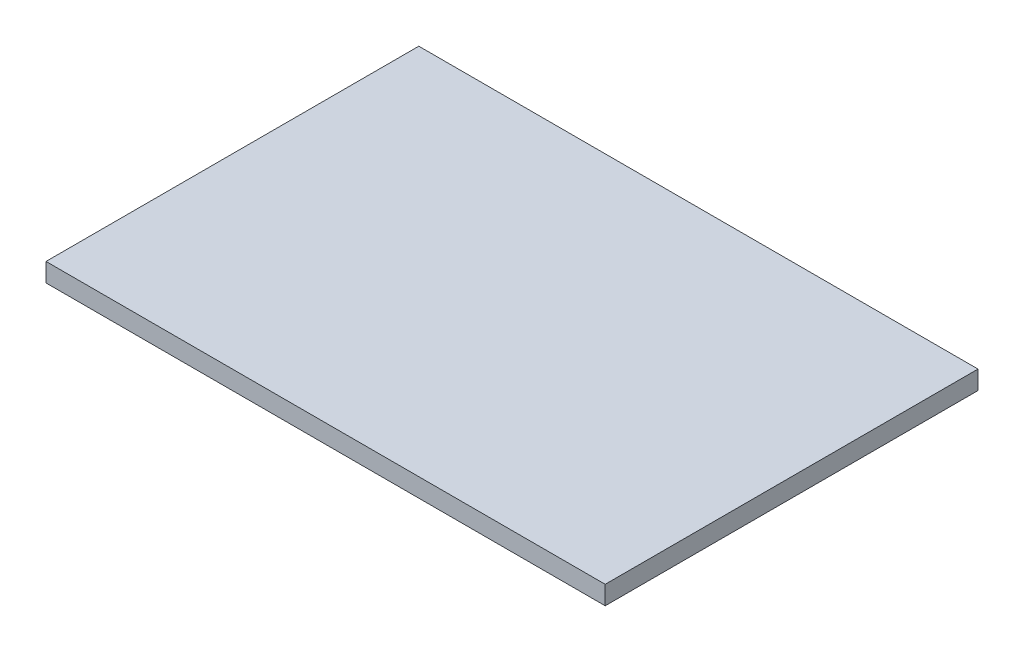
ISO-10303-21;
HEADER;
FILE_DESCRIPTION(('STEP AP214'),'2;1');
FILE_NAME('part.step','',(''),(''),'','','');
FILE_SCHEMA(('AUTOMOTIVE_DESIGN { 1 0 10303 214 1 1 1 1 }'));
ENDSEC;
DATA;
#1=APPLICATION_CONTEXT('core data for automotive mechanical design processes');
#2=APPLICATION_PROTOCOL_DEFINITION('international standard','automotive_design',2000,#1);
#3=PRODUCT_CONTEXT('',#1,'mechanical');
#4=PRODUCT('Part','Part','',(#3));
#5=PRODUCT_RELATED_PRODUCT_CATEGORY('part','',(#4));
#6=PRODUCT_DEFINITION_FORMATION('','',#4);
#7=PRODUCT_DEFINITION_CONTEXT('part definition',#1,'design');
#8=PRODUCT_DEFINITION('design','',#6,#7);
#9=PRODUCT_DEFINITION_SHAPE('','',#8);
#10=(LENGTH_UNIT() NAMED_UNIT(*) SI_UNIT(.MILLI.,.METRE.));
#11=(NAMED_UNIT(*) PLANE_ANGLE_UNIT() SI_UNIT($,.RADIAN.));
#12=(NAMED_UNIT(*) SI_UNIT($,.STERADIAN.) SOLID_ANGLE_UNIT());
#13=UNCERTAINTY_MEASURE_WITH_UNIT(LENGTH_MEASURE(1.E-05),#10,'distance_accuracy_value','');
#14=(GEOMETRIC_REPRESENTATION_CONTEXT(3) GLOBAL_UNCERTAINTY_ASSIGNED_CONTEXT((#13)) GLOBAL_UNIT_ASSIGNED_CONTEXT((#10,
#11,#12)) REPRESENTATION_CONTEXT('',''));
#15=CARTESIAN_POINT('',(0.,0.,0.));
#16=DIRECTION('',(0.,0.,1.));
#17=DIRECTION('',(1.,0.,0.));
#18=AXIS2_PLACEMENT_3D('',#15,#16,#17);
#19=CARTESIAN_POINT('',(150.,10.,100.));
#20=DIRECTION('',(-1.,0.,0.));
#21=DIRECTION('',(0.,0.,1.));
#22=AXIS2_PLACEMENT_3D('',#19,#20,#21);
#23=PLANE('',#22);
#24=DIRECTION('',(0.,0.,-1.));
#25=VECTOR('',#24,1.);
#26=CARTESIAN_POINT('',(150.,0.,100.));
#27=LINE('',#26,#25);
#28=CARTESIAN_POINT('',(150.,0.,100.));
#29=VERTEX_POINT('',#28);
#30=CARTESIAN_POINT('',(150.,0.,-100.));
#31=VERTEX_POINT('',#30);
#32=EDGE_CURVE('E96',#29,#31,#27,.T.);
#33=ORIENTED_EDGE('',*,*,#32,.T.);
#34=DIRECTION('',(0.,-1.,0.));
#35=VECTOR('',#34,1.);
#36=CARTESIAN_POINT('',(150.,10.,-100.));
#37=LINE('',#36,#35);
#38=CARTESIAN_POINT('',(150.,10.,-100.));
#39=VERTEX_POINT('',#38);
#40=EDGE_CURVE('E11',#39,#31,#37,.T.);
#41=ORIENTED_EDGE('',*,*,#40,.F.);
#42=DIRECTION('',(0.,0.,-1.));
#43=VECTOR('',#42,1.);
#44=CARTESIAN_POINT('',(150.,10.,100.));
#45=LINE('',#44,#43);
#46=CARTESIAN_POINT('',(150.,10.,100.));
#47=VERTEX_POINT('',#46);
#48=EDGE_CURVE('E84',#47,#39,#45,.T.);
#49=ORIENTED_EDGE('',*,*,#48,.F.);
#50=DIRECTION('',(0.,-1.,0.));
#51=VECTOR('',#50,1.);
#52=CARTESIAN_POINT('',(150.,10.,100.));
#53=LINE('',#52,#51);
#54=EDGE_CURVE('E92',#47,#29,#53,.T.);
#55=ORIENTED_EDGE('',*,*,#54,.T.);
#56=EDGE_LOOP('',(#33,#41,#49,#55));
#57=FACE_BOUND('',#56,.T.);
#58=ADVANCED_FACE('F33',(#57),#23,.F.);
#59=CARTESIAN_POINT('',(-150.,10.,-100.));
#60=DIRECTION('',(0.,0.,1.));
#61=DIRECTION('',(1.,0.,0.));
#62=AXIS2_PLACEMENT_3D('',#59,#60,#61);
#63=PLANE('',#62);
#64=DIRECTION('',(-1.,0.,0.));
#65=VECTOR('',#64,1.);
#66=CARTESIAN_POINT('',(-150.,0.,-100.));
#67=LINE('',#66,#65);
#68=CARTESIAN_POINT('',(-150.,0.,-100.));
#69=VERTEX_POINT('',#68);
#70=EDGE_CURVE('E88',#31,#69,#67,.T.);
#71=ORIENTED_EDGE('',*,*,#70,.T.);
#72=DIRECTION('',(0.,-1.,0.));
#73=VECTOR('',#72,1.);
#74=CARTESIAN_POINT('',(-150.,10.,-100.));
#75=LINE('',#74,#73);
#76=CARTESIAN_POINT('',(-150.,10.,-100.));
#77=VERTEX_POINT('',#76);
#78=EDGE_CURVE('E41',#77,#69,#75,.T.);
#79=ORIENTED_EDGE('',*,*,#78,.F.);
#80=DIRECTION('',(-1.,0.,0.));
#81=VECTOR('',#80,1.);
#82=CARTESIAN_POINT('',(-150.,10.,-100.));
#83=LINE('',#82,#81);
#84=EDGE_CURVE('E79',#39,#77,#83,.T.);
#85=ORIENTED_EDGE('',*,*,#84,.F.);
#86=ORIENTED_EDGE('',*,*,#40,.T.);
#87=EDGE_LOOP('',(#71,#79,#85,#86));
#88=FACE_BOUND('',#87,.T.);
#89=ADVANCED_FACE('F87',(#88),#63,.F.);
#90=CARTESIAN_POINT('',(-150.,10.,100.));
#91=DIRECTION('',(1.,0.,0.));
#92=DIRECTION('',(0.,0.,-1.));
#93=AXIS2_PLACEMENT_3D('',#90,#91,#92);
#94=PLANE('',#93);
#95=DIRECTION('',(0.,0.,1.));
#96=VECTOR('',#95,1.);
#97=CARTESIAN_POINT('',(-150.,0.,100.));
#98=LINE('',#97,#96);
#99=CARTESIAN_POINT('',(-150.,0.,100.));
#100=VERTEX_POINT('',#99);
#101=EDGE_CURVE('E66',#69,#100,#98,.T.);
#102=ORIENTED_EDGE('',*,*,#101,.T.);
#103=DIRECTION('',(0.,-1.,0.));
#104=VECTOR('',#103,1.);
#105=CARTESIAN_POINT('',(-150.,10.,100.));
#106=LINE('',#105,#104);
#107=CARTESIAN_POINT('',(-150.,10.,100.));
#108=VERTEX_POINT('',#107);
#109=EDGE_CURVE('E89',#108,#100,#106,.T.);
#110=ORIENTED_EDGE('',*,*,#109,.F.);
#111=DIRECTION('',(0.,0.,1.));
#112=VECTOR('',#111,1.);
#113=CARTESIAN_POINT('',(-150.,10.,100.));
#114=LINE('',#113,#112);
#115=EDGE_CURVE('E82',#77,#108,#114,.T.);
#116=ORIENTED_EDGE('',*,*,#115,.F.);
#117=ORIENTED_EDGE('',*,*,#78,.T.);
#118=EDGE_LOOP('',(#102,#110,#116,#117));
#119=FACE_BOUND('',#118,.T.);
#120=ADVANCED_FACE('F90',(#119),#94,.F.);
#121=CARTESIAN_POINT('',(-150.,10.,100.));
#122=DIRECTION('',(0.,0.,-1.));
#123=DIRECTION('',(-1.,0.,0.));
#124=AXIS2_PLACEMENT_3D('',#121,#122,#123);
#125=PLANE('',#124);
#126=DIRECTION('',(1.,0.,0.));
#127=VECTOR('',#126,1.);
#128=CARTESIAN_POINT('',(-150.,0.,100.));
#129=LINE('',#128,#127);
#130=EDGE_CURVE('E72',#100,#29,#129,.T.);
#131=ORIENTED_EDGE('',*,*,#130,.T.);
#132=ORIENTED_EDGE('',*,*,#54,.F.);
#133=DIRECTION('',(1.,0.,0.));
#134=VECTOR('',#133,1.);
#135=CARTESIAN_POINT('',(-150.,10.,100.));
#136=LINE('',#135,#134);
#137=EDGE_CURVE('E49',#108,#47,#136,.T.);
#138=ORIENTED_EDGE('',*,*,#137,.F.);
#139=ORIENTED_EDGE('',*,*,#109,.T.);
#140=EDGE_LOOP('',(#131,#132,#138,#139));
#141=FACE_BOUND('',#140,.T.);
#142=ADVANCED_FACE('F103',(#141),#125,.F.);
#143=CARTESIAN_POINT('',(0.,10.,0.));
#144=DIRECTION('',(0.,-1.,0.));
#145=DIRECTION('',(0.,0.,-1.));
#146=AXIS2_PLACEMENT_3D('',#143,#144,#145);
#147=PLANE('',#146);
#148=ORIENTED_EDGE('',*,*,#48,.T.);
#149=ORIENTED_EDGE('',*,*,#84,.T.);
#150=ORIENTED_EDGE('',*,*,#115,.T.);
#151=ORIENTED_EDGE('',*,*,#137,.T.);
#152=EDGE_LOOP('',(#148,#149,#150,#151));
#153=FACE_BOUND('',#152,.T.);
#154=ADVANCED_FACE('F80',(#153),#147,.F.);
#155=CARTESIAN_POINT('',(0.,0.,0.));
#156=DIRECTION('',(0.,-1.,0.));
#157=DIRECTION('',(0.,0.,-1.));
#158=AXIS2_PLACEMENT_3D('',#155,#156,#157);
#159=PLANE('',#158);
#160=ORIENTED_EDGE('',*,*,#32,.F.);
#161=ORIENTED_EDGE('',*,*,#130,.F.);
#162=ORIENTED_EDGE('',*,*,#101,.F.);
#163=ORIENTED_EDGE('',*,*,#70,.F.);
#164=EDGE_LOOP('',(#160,#161,#162,#163));
#165=FACE_BOUND('',#164,.T.);
#166=ADVANCED_FACE('F106',(#165),#159,.T.);
#167=CLOSED_SHELL('',(#58,#89,#120,#142,#154,#166));
#168=MANIFOLD_SOLID_BREP('B2',#167);
#169=ADVANCED_BREP_SHAPE_REPRESENTATION('',(#18,#168),#14);
#170=SHAPE_DEFINITION_REPRESENTATION(#9,#169);
ENDSEC;
END-ISO-10303-21;
